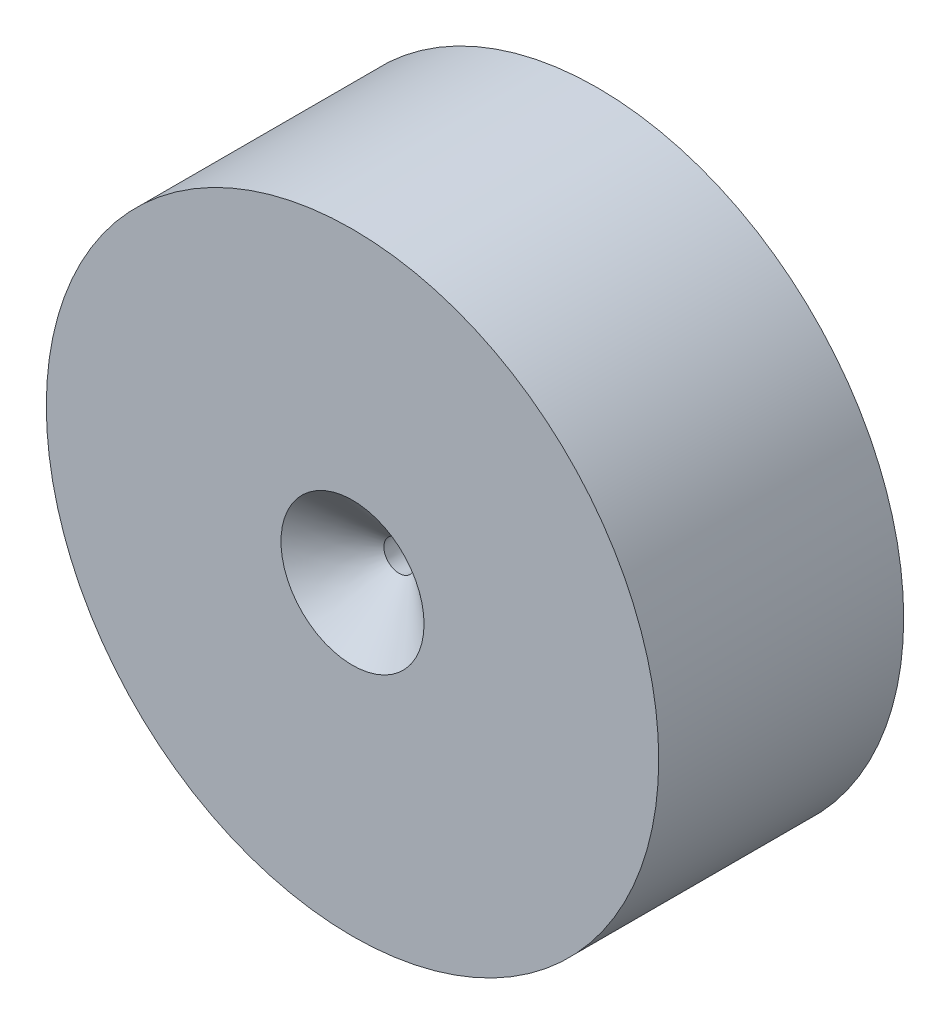
ISO-10303-21;
HEADER;
FILE_DESCRIPTION(('STEP AP214'),'2;1');
FILE_NAME('part.step','',(''),(''),'','','');
FILE_SCHEMA(('AUTOMOTIVE_DESIGN { 1 0 10303 214 1 1 1 1 }'));
ENDSEC;
DATA;
#1=APPLICATION_CONTEXT('core data for automotive mechanical design processes');
#2=APPLICATION_PROTOCOL_DEFINITION('international standard','automotive_design',2000,#1);
#3=PRODUCT_CONTEXT('',#1,'mechanical');
#4=PRODUCT('Part','Part','',(#3));
#5=PRODUCT_RELATED_PRODUCT_CATEGORY('part','',(#4));
#6=PRODUCT_DEFINITION_FORMATION('','',#4);
#7=PRODUCT_DEFINITION_CONTEXT('part definition',#1,'design');
#8=PRODUCT_DEFINITION('design','',#6,#7);
#9=PRODUCT_DEFINITION_SHAPE('','',#8);
#10=(LENGTH_UNIT() NAMED_UNIT(*) SI_UNIT(.MILLI.,.METRE.));
#11=(NAMED_UNIT(*) PLANE_ANGLE_UNIT() SI_UNIT($,.RADIAN.));
#12=(NAMED_UNIT(*) SI_UNIT($,.STERADIAN.) SOLID_ANGLE_UNIT());
#13=UNCERTAINTY_MEASURE_WITH_UNIT(LENGTH_MEASURE(1.E-05),#10,'distance_accuracy_value','');
#14=(GEOMETRIC_REPRESENTATION_CONTEXT(3) GLOBAL_UNCERTAINTY_ASSIGNED_CONTEXT((#13)) GLOBAL_UNIT_ASSIGNED_CONTEXT((#10,
#11,#12)) REPRESENTATION_CONTEXT('',''));
#15=CARTESIAN_POINT('',(0.,0.,0.));
#16=DIRECTION('',(0.,0.,1.));
#17=DIRECTION('',(1.,0.,0.));
#18=AXIS2_PLACEMENT_3D('',#15,#16,#17);
#19=CARTESIAN_POINT('',(0.,0.,4.));
#20=DIRECTION('',(0.,0.,-1.));
#21=DIRECTION('',(-1.,0.,0.));
#22=AXIS2_PLACEMENT_3D('',#19,#20,#21);
#23=CYLINDRICAL_SURFACE('',#22,5.);
#24=CARTESIAN_POINT('',(0.,0.,4.));
#25=DIRECTION('',(0.,0.,1.));
#26=DIRECTION('',(1.,0.,0.));
#27=AXIS2_PLACEMENT_3D('',#24,#25,#26);
#28=CIRCLE('',#27,5.);
#29=CARTESIAN_POINT('',(5.,0.,4.));
#30=VERTEX_POINT('',#29);
#31=EDGE_CURVE('E10',#30,#30,#28,.T.);
#32=ORIENTED_EDGE('',*,*,#31,.F.);
#33=EDGE_LOOP('',(#32));
#34=FACE_BOUND('',#33,.T.);
#35=CARTESIAN_POINT('',(0.,0.,0.));
#36=DIRECTION('',(0.,0.,1.));
#37=DIRECTION('',(1.,0.,0.));
#38=AXIS2_PLACEMENT_3D('',#35,#36,#37);
#39=CIRCLE('',#38,5.);
#40=CARTESIAN_POINT('',(5.,0.,0.));
#41=VERTEX_POINT('',#40);
#42=EDGE_CURVE('E40',#41,#41,#39,.T.);
#43=ORIENTED_EDGE('',*,*,#42,.T.);
#44=EDGE_LOOP('',(#43));
#45=FACE_BOUND('',#44,.T.);
#46=ADVANCED_FACE('F37',(#34,#45),#23,.T.);
#47=CARTESIAN_POINT('',(0.,0.,4.));
#48=DIRECTION('',(0.,0.,1.));
#49=DIRECTION('',(1.,0.,0.));
#50=AXIS2_PLACEMENT_3D('',#47,#48,#49);
#51=PLANE('',#50);
#52=CARTESIAN_POINT('',(0.,0.,4.));
#53=DIRECTION('',(0.,0.,-1.));
#54=DIRECTION('',(-1.,0.,0.));
#55=AXIS2_PLACEMENT_3D('',#52,#53,#54);
#56=CIRCLE('',#55,1.16805381370425);
#57=CARTESIAN_POINT('',(1.16805381370425,0.,4.));
#58=VERTEX_POINT('',#57);
#59=EDGE_CURVE('E49',#58,#58,#56,.T.);
#60=ORIENTED_EDGE('',*,*,#59,.T.);
#61=EDGE_LOOP('',(#60));
#62=FACE_BOUND('',#61,.T.);
#63=ORIENTED_EDGE('',*,*,#31,.T.);
#64=EDGE_LOOP('',(#63));
#65=FACE_BOUND('',#64,.T.);
#66=ADVANCED_FACE('F73',(#62,#65),#51,.T.);
#67=CARTESIAN_POINT('',(0.,0.,0.));
#68=DIRECTION('',(0.,0.,1.));
#69=DIRECTION('',(1.,0.,0.));
#70=AXIS2_PLACEMENT_3D('',#67,#68,#69);
#71=PLANE('',#70);
#72=CARTESIAN_POINT('',(0.,0.,0.));
#73=DIRECTION('',(0.,0.,-1.));
#74=DIRECTION('',(-1.,0.,0.));
#75=AXIS2_PLACEMENT_3D('',#72,#73,#74);
#76=CIRCLE('',#75,2.);
#77=CARTESIAN_POINT('',(-2.,0.,0.));
#78=VERTEX_POINT('',#77);
#79=EDGE_CURVE('E62',#78,#78,#76,.T.);
#80=ORIENTED_EDGE('',*,*,#79,.F.);
#81=EDGE_LOOP('',(#80));
#82=FACE_BOUND('',#81,.T.);
#83=ORIENTED_EDGE('',*,*,#42,.F.);
#84=EDGE_LOOP('',(#83));
#85=FACE_BOUND('',#84,.T.);
#86=ADVANCED_FACE('F69',(#82,#85),#71,.F.);
#87=CARTESIAN_POINT('',(0.,0.,3.23793688797678));
#88=DIRECTION('',(0.,0.,1.));
#89=DIRECTION('',(1.,0.,0.));
#90=AXIS2_PLACEMENT_3D('',#87,#88,#89);
#91=CONICAL_SURFACE('',#90,0.25,0.877977899137484);
#92=CARTESIAN_POINT('',(0.,0.,3.23793688797678));
#93=DIRECTION('',(0.,0.,-1.));
#94=DIRECTION('',(-1.,0.,0.));
#95=AXIS2_PLACEMENT_3D('',#92,#93,#94);
#96=CIRCLE('',#95,0.25);
#97=CARTESIAN_POINT('',(0.25,0.,3.23793688797678));
#98=VERTEX_POINT('',#97);
#99=EDGE_CURVE('E54',#98,#98,#96,.T.);
#100=CARTESIAN_POINT('',(1.16805381370425,0.,4.));
#101=CARTESIAN_POINT('',(1.15849075314483,0.,3.99206184258309));
#102=CARTESIAN_POINT('',(1.14892769258541,0.,3.98412368516618));
#103=CARTESIAN_POINT('',(1.12980157146658,0.,3.96824737033237));
#104=CARTESIAN_POINT('',(1.12023851090716,0.,3.96030921291546));
#105=CARTESIAN_POINT('',(1.10111238978832,0.,3.94443289808164));
#106=CARTESIAN_POINT('',(1.0915493292289,0.,3.93649474066473));
#107=CARTESIAN_POINT('',(1.07242320811006,0.,3.92061842583092));
#108=CARTESIAN_POINT('',(1.06286014755064,0.,3.91268026841401));
#109=CARTESIAN_POINT('',(1.0437340264318,0.,3.89680395358019));
#110=CARTESIAN_POINT('',(1.03417096587238,0.,3.88886579616328));
#111=CARTESIAN_POINT('',(1.01504484475354,0.,3.87298948132946));
#112=CARTESIAN_POINT('',(1.00548178419412,0.,3.86505132391256));
#113=CARTESIAN_POINT('',(0.986355663075286,0.,3.84917500907874));
#114=CARTESIAN_POINT('',(0.976792602515867,0.,3.84123685166183));
#115=CARTESIAN_POINT('',(0.957666481397028,0.,3.82536053682801));
#116=CARTESIAN_POINT('',(0.948103420837609,0.,3.8174223794111));
#117=CARTESIAN_POINT('',(0.92897729971877,0.,3.80154606457729));
#118=CARTESIAN_POINT('',(0.919414239159351,0.,3.79360790716038));
#119=CARTESIAN_POINT('',(0.900288118040512,0.,3.77773159232656));
#120=CARTESIAN_POINT('',(0.890725057481093,0.,3.76979343490965));
#121=CARTESIAN_POINT('',(0.871598936362254,0.,3.75391712007584));
#122=CARTESIAN_POINT('',(0.862035875802835,0.,3.74597896265893));
#123=CARTESIAN_POINT('',(0.842909754683996,0.,3.73010264782511));
#124=CARTESIAN_POINT('',(0.833346694124577,0.,3.7221644904082));
#125=CARTESIAN_POINT('',(0.814220573005738,0.,3.70628817557439));
#126=CARTESIAN_POINT('',(0.804657512446319,0.,3.69835001815748));
#127=CARTESIAN_POINT('',(0.785531391327481,0.,3.68247370332366));
#128=CARTESIAN_POINT('',(0.775968330768061,0.,3.67453554590675));
#129=CARTESIAN_POINT('',(0.756842209649223,0.,3.65865923107294));
#130=CARTESIAN_POINT('',(0.747279149089804,0.,3.65072107365603));
#131=CARTESIAN_POINT('',(0.728153027970965,0.,3.63484475882221));
#132=CARTESIAN_POINT('',(0.718589967411546,0.,3.6269066014053));
#133=CARTESIAN_POINT('',(0.699463846292707,0.,3.61103028657148));
#134=CARTESIAN_POINT('',(0.689900785733288,0.,3.60309212915458));
#135=CARTESIAN_POINT('',(0.670774664614449,0.,3.58721581432076));
#136=CARTESIAN_POINT('',(0.66121160405503,0.,3.57927765690385));
#137=CARTESIAN_POINT('',(0.642085482936191,0.,3.56340134207003));
#138=CARTESIAN_POINT('',(0.632522422376772,0.,3.55546318465312));
#139=CARTESIAN_POINT('',(0.613396301257933,0.,3.53958686981931));
#140=CARTESIAN_POINT('',(0.603833240698514,0.,3.5316487124024));
#141=CARTESIAN_POINT('',(0.584707119579676,0.,3.51577239756858));
#142=CARTESIAN_POINT('',(0.575144059020256,0.,3.50783424015167));
#143=CARTESIAN_POINT('',(0.556017937901418,0.,3.49195792531786));
#144=CARTESIAN_POINT('',(0.546454877341998,0.,3.48401976790095));
#145=CARTESIAN_POINT('',(0.52732875622316,0.,3.46814345306713));
#146=CARTESIAN_POINT('',(0.517765695663741,0.,3.46020529565022));
#147=CARTESIAN_POINT('',(0.498639574544902,0.,3.44432898081641));
#148=CARTESIAN_POINT('',(0.489076513985483,0.,3.4363908233995));
#149=CARTESIAN_POINT('',(0.469950392866644,0.,3.42051450856568));
#150=CARTESIAN_POINT('',(0.460387332307225,0.,3.41257635114877));
#151=CARTESIAN_POINT('',(0.441261211188386,0.,3.39670003631495));
#152=CARTESIAN_POINT('',(0.431698150628967,0.,3.38876187889805));
#153=CARTESIAN_POINT('',(0.412572029510128,0.,3.37288556406423));
#154=CARTESIAN_POINT('',(0.403008968950709,0.,3.36494740664732));
#155=CARTESIAN_POINT('',(0.38388284783187,0.,3.3490710918135));
#156=CARTESIAN_POINT('',(0.374319787272451,0.,3.34113293439659));
#157=CARTESIAN_POINT('',(0.355193666153613,0.,3.32525661956278));
#158=CARTESIAN_POINT('',(0.345630605594193,0.,3.31731846214587));
#159=CARTESIAN_POINT('',(0.326504484475355,0.,3.30144214731205));
#160=CARTESIAN_POINT('',(0.316941423915935,0.,3.29350398989514));
#161=CARTESIAN_POINT('',(0.297815302797097,0.,3.27762767506133));
#162=CARTESIAN_POINT('',(0.288252242237677,0.,3.26968951764442));
#163=CARTESIAN_POINT('',(0.269126121118839,0.,3.2538132028106));
#164=CARTESIAN_POINT('',(0.25956306055942,0.,3.24587504539369));
#165=CARTESIAN_POINT('',(0.25,0.,3.23793688797678));
#166=B_SPLINE_CURVE_WITH_KNOTS('',3,(#100,#101,#102,#103,#104,#105,#106,#107,#108,#109,#110,
#111,#112,#113,#114,#115,#116,#117,#118,#119,#120,#121,#122,#123,#124,#125,#126,#127,#128,#129,
#130,#131,#132,#133,#134,#135,#136,#137,#138,#139,#140,#141,#142,#143,#144,#145,#146,#147,#148,
#149,#150,#151,#152,#153,#154,#155,#156,#157,#158,#159,#160,#161,#162,#163,#164,#165),
.UNSPECIFIED.,.F.,.F.,(4,2,2,2,2,2,2,2,2,2,2,2,2,2,2,2,2,2,2,2,2,2,2,2,2,2,2,2,2,2,2,2,4),(0.,
0.0372853621941461,0.0745707243882918,0.111856086582438,0.149141448776585,0.186426810970731,
0.223712173164876,0.260997535359023,0.298282897553169,0.335568259747315,0.372853621941461,
0.410138984135607,0.447424346329754,0.4847097085239,0.521995070718046,0.559280432912192,
0.596565795106338,0.633851157300484,0.67113651949463,0.708421881688776,0.745707243882923,
0.782992606077069,0.820277968271215,0.857563330465361,0.894848692659507,0.932134054853653,
0.9694194170478,1.00670477924195,1.04399014143609,1.08127550363024,1.11856086582438,
1.15584622801853,1.19313159021268),.UNSPECIFIED.);
#167=EDGE_CURVE('BSEAM72',#58,#98,#166,.T.);
#168=ORIENTED_EDGE('',*,*,#59,.F.);
#169=ORIENTED_EDGE('',*,*,#99,.T.);
#170=ORIENTED_EDGE('',*,*,#167,.T.);
#171=ORIENTED_EDGE('',*,*,#167,.F.);
#172=EDGE_LOOP('',(#168,#170,#169,#171));
#173=FACE_BOUND('',#172,.T.);
#174=ADVANCED_FACE('F72',(#173),#91,.F.);
#175=CARTESIAN_POINT('',(0.,0.,1.30781996224933));
#176=DIRECTION('',(0.,0.,-1.));
#177=DIRECTION('',(-1.,0.,0.));
#178=AXIS2_PLACEMENT_3D('',#175,#176,#177);
#179=CONICAL_SURFACE('',#178,0.5,0.128808687740445);
#180=ORIENTED_EDGE('',*,*,#99,.F.);
#181=EDGE_LOOP('',(#180));
#182=FACE_BOUND('',#181,.T.);
#183=CARTESIAN_POINT('',(0.,0.,1.30781996224933));
#184=DIRECTION('',(0.,0.,-1.));
#185=DIRECTION('',(-1.,0.,0.));
#186=AXIS2_PLACEMENT_3D('',#183,#184,#185);
#187=CIRCLE('',#186,0.5);
#188=CARTESIAN_POINT('',(-0.5,0.,1.30781996224933));
#189=VERTEX_POINT('',#188);
#190=EDGE_CURVE('E58',#189,#189,#187,.T.);
#191=ORIENTED_EDGE('',*,*,#190,.T.);
#192=EDGE_LOOP('',(#191));
#193=FACE_BOUND('',#192,.T.);
#194=ADVANCED_FACE('F88',(#182,#193),#179,.F.);
#195=CARTESIAN_POINT('',(0.,0.,0.));
#196=DIRECTION('',(0.,0.,-1.));
#197=DIRECTION('',(-1.,0.,0.));
#198=AXIS2_PLACEMENT_3D('',#195,#196,#197);
#199=CONICAL_SURFACE('',#198,2.,0.853736155749832);
#200=CARTESIAN_POINT('',(-0.5,0.,1.30781996224933));
#201=CARTESIAN_POINT('',(-0.515625,0.,1.29419683764257));
#202=CARTESIAN_POINT('',(-0.53125,0.,1.2805737130358));
#203=CARTESIAN_POINT('',(-0.5625,0.,1.25332746382228));
#204=CARTESIAN_POINT('',(-0.578125,0.,1.23970433921551));
#205=CARTESIAN_POINT('',(-0.609375,0.,1.21245809000198));
#206=CARTESIAN_POINT('',(-0.625,0.,1.19883496539522));
#207=CARTESIAN_POINT('',(-0.65625,0.,1.17158871618169));
#208=CARTESIAN_POINT('',(-0.671875,0.,1.15796559157493));
#209=CARTESIAN_POINT('',(-0.703125,0.,1.1307193423614));
#210=CARTESIAN_POINT('',(-0.71875,0.,1.11709621775464));
#211=CARTESIAN_POINT('',(-0.75,0.,1.08984996854111));
#212=CARTESIAN_POINT('',(-0.765625,0.,1.07622684393434));
#213=CARTESIAN_POINT('',(-0.796875,0.,1.04898059472082));
#214=CARTESIAN_POINT('',(-0.8125,0.,1.03535747011405));
#215=CARTESIAN_POINT('',(-0.84375,0.,1.00811122090053));
#216=CARTESIAN_POINT('',(-0.859375,0.,0.994488096293762));
#217=CARTESIAN_POINT('',(-0.890625,0.,0.967241847080234));
#218=CARTESIAN_POINT('',(-0.90625,0.,0.95361872247347));
#219=CARTESIAN_POINT('',(-0.9375,0.,0.926372473259942));
#220=CARTESIAN_POINT('',(-0.953125,0.,0.912749348653179));
#221=CARTESIAN_POINT('',(-0.984375,0.,0.885503099439651));
#222=CARTESIAN_POINT('',(-1.,0.,0.871879974832887));
#223=CARTESIAN_POINT('',(-1.03125,0.,0.844633725619359));
#224=CARTESIAN_POINT('',(-1.046875,0.,0.831010601012595));
#225=CARTESIAN_POINT('',(-1.078125,0.,0.803764351799068));
#226=CARTESIAN_POINT('',(-1.09375,0.,0.790141227192304));
#227=CARTESIAN_POINT('',(-1.125,0.,0.762894977978776));
#228=CARTESIAN_POINT('',(-1.140625,0.,0.749271853372012));
#229=CARTESIAN_POINT('',(-1.171875,0.,0.722025604158485));
#230=CARTESIAN_POINT('',(-1.1875,0.,0.708402479551721));
#231=CARTESIAN_POINT('',(-1.21875,0.,0.681156230338193));
#232=CARTESIAN_POINT('',(-1.234375,0.,0.667533105731429));
#233=CARTESIAN_POINT('',(-1.265625,0.,0.640286856517901));
#234=CARTESIAN_POINT('',(-1.28125,0.,0.626663731911138));
#235=CARTESIAN_POINT('',(-1.3125,0.,0.59941748269761));
#236=CARTESIAN_POINT('',(-1.328125,0.,0.585794358090846));
#237=CARTESIAN_POINT('',(-1.359375,0.,0.558548108877318));
#238=CARTESIAN_POINT('',(-1.375,0.,0.544924984270554));
#239=CARTESIAN_POINT('',(-1.40625,0.,0.517678735057027));
#240=CARTESIAN_POINT('',(-1.421875,0.,0.504055610450263));
#241=CARTESIAN_POINT('',(-1.453125,0.,0.476809361236735));
#242=CARTESIAN_POINT('',(-1.46875,0.,0.463186236629971));
#243=CARTESIAN_POINT('',(-1.5,0.,0.435939987416444));
#244=CARTESIAN_POINT('',(-1.515625,0.,0.42231686280968));
#245=CARTESIAN_POINT('',(-1.546875,0.,0.395070613596152));
#246=CARTESIAN_POINT('',(-1.5625,0.,0.381447488989388));
#247=CARTESIAN_POINT('',(-1.59375,0.,0.35420123977586));
#248=CARTESIAN_POINT('',(-1.609375,0.,0.340578115169096));
#249=CARTESIAN_POINT('',(-1.640625,0.,0.313331865955569));
#250=CARTESIAN_POINT('',(-1.65625,0.,0.299708741348805));
#251=CARTESIAN_POINT('',(-1.6875,0.,0.272462492135277));
#252=CARTESIAN_POINT('',(-1.703125,0.,0.258839367528513));
#253=CARTESIAN_POINT('',(-1.734375,0.,0.231593118314986));
#254=CARTESIAN_POINT('',(-1.75,0.,0.217969993708222));
#255=CARTESIAN_POINT('',(-1.78125,0.,0.190723744494694));
#256=CARTESIAN_POINT('',(-1.796875,0.,0.17710061988793));
#257=CARTESIAN_POINT('',(-1.828125,0.,0.149854370674402));
#258=CARTESIAN_POINT('',(-1.84375,0.,0.136231246067639));
#259=CARTESIAN_POINT('',(-1.875,0.,0.108984996854111));
#260=CARTESIAN_POINT('',(-1.890625,0.,0.095361872247347));
#261=CARTESIAN_POINT('',(-1.921875,0.,0.0681156230338193));
#262=CARTESIAN_POINT('',(-1.9375,0.,0.0544924984270554));
#263=CARTESIAN_POINT('',(-1.96875,0.,0.0272462492135277));
#264=CARTESIAN_POINT('',(-1.984375,0.,0.0136231246067639));
#265=CARTESIAN_POINT('',(-2.,0.,0.));
#266=B_SPLINE_CURVE_WITH_KNOTS('',3,(#200,#201,#202,#203,#204,#205,#206,#207,#208,#209,#210,
#211,#212,#213,#214,#215,#216,#217,#218,#219,#220,#221,#222,#223,#224,#225,#226,#227,#228,#229,
#230,#231,#232,#233,#234,#235,#236,#237,#238,#239,#240,#241,#242,#243,#244,#245,#246,#247,#248,
#249,#250,#251,#252,#253,#254,#255,#256,#257,#258,#259,#260,#261,#262,#263,#264,#265),
.UNSPECIFIED.,.F.,.F.,(4,2,2,2,2,2,2,2,2,2,2,2,2,2,2,2,2,2,2,2,2,2,2,2,2,2,2,2,2,2,2,2,4),(0.,
0.0621898009440675,0.124379601888135,0.186569402832202,0.24875920377627,0.310949004720337,
0.373138805664405,0.435328606608472,0.49751840755254,0.559708208496607,0.621898009440675,
0.684087810384742,0.74627761132881,0.808467412272877,0.870657213216945,0.932847014161012,
0.995036815105079,1.05722661604915,1.11941641699321,1.18160621793728,1.24379601888135,
1.30598581982542,1.36817562076948,1.43036542171355,1.49255522265762,1.55474502360169,
1.61693482454575,1.67912462548982,1.74131442643389,1.80350422737796,1.86569402832202,
1.92788382926609,1.99007363021016),.UNSPECIFIED.);
#267=EDGE_CURVE('BSEAM67',#189,#78,#266,.T.);
#268=ORIENTED_EDGE('',*,*,#190,.F.);
#269=ORIENTED_EDGE('',*,*,#79,.T.);
#270=ORIENTED_EDGE('',*,*,#267,.T.);
#271=ORIENTED_EDGE('',*,*,#267,.F.);
#272=EDGE_LOOP('',(#268,#270,#269,#271));
#273=FACE_BOUND('',#272,.T.);
#274=ADVANCED_FACE('F67',(#273),#199,.F.);
#275=CLOSED_SHELL('',(#46,#66,#86,#174,#194,#274));
#276=MANIFOLD_SOLID_BREP('B2',#275);
#277=ADVANCED_BREP_SHAPE_REPRESENTATION('',(#18,#276),#14);
#278=SHAPE_DEFINITION_REPRESENTATION(#9,#277);
ENDSEC;
END-ISO-10303-21;
